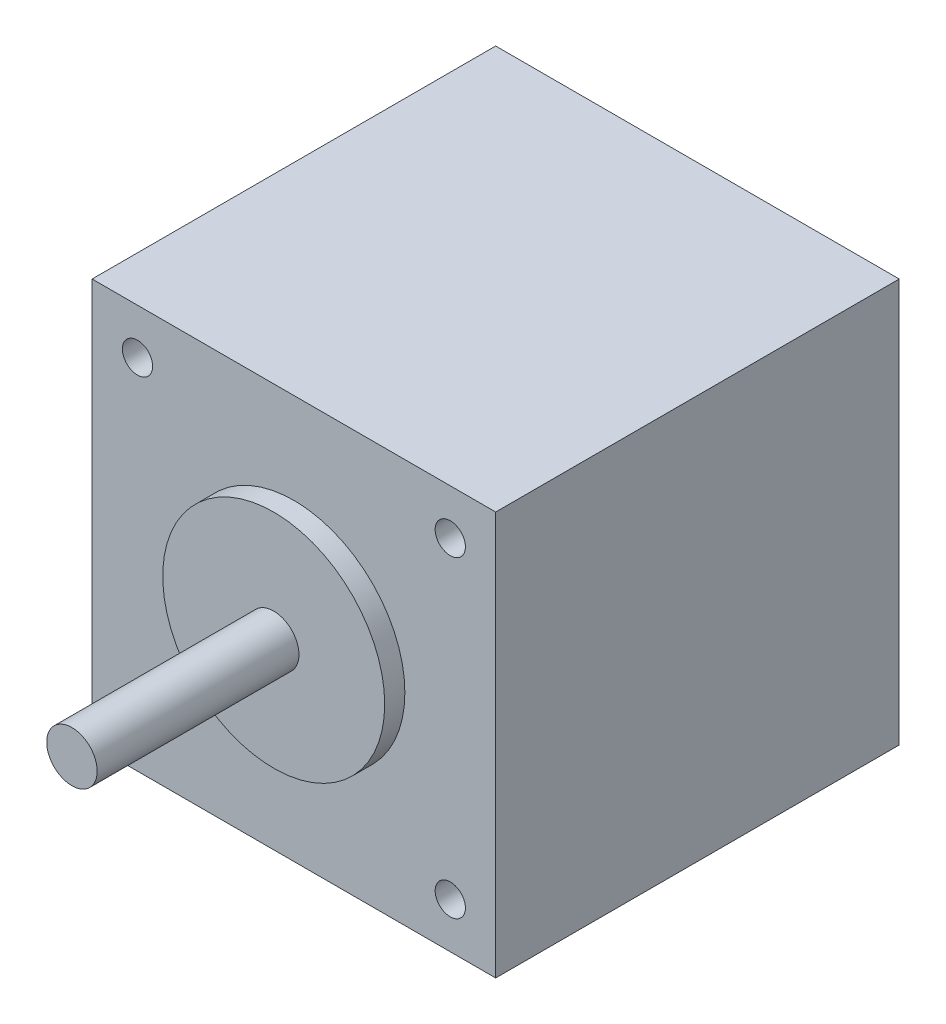
ISO-10303-21;
HEADER;
FILE_DESCRIPTION(('STEP AP214'),'2;1');
FILE_NAME('part.step','',(''),(''),'','','');
FILE_SCHEMA(('AUTOMOTIVE_DESIGN { 1 0 10303 214 1 1 1 1 }'));
ENDSEC;
DATA;
#1=APPLICATION_CONTEXT('core data for automotive mechanical design processes');
#2=APPLICATION_PROTOCOL_DEFINITION('international standard','automotive_design',2000,#1);
#3=PRODUCT_CONTEXT('',#1,'mechanical');
#4=PRODUCT('Part','Part','',(#3));
#5=PRODUCT_RELATED_PRODUCT_CATEGORY('part','',(#4));
#6=PRODUCT_DEFINITION_FORMATION('','',#4);
#7=PRODUCT_DEFINITION_CONTEXT('part definition',#1,'design');
#8=PRODUCT_DEFINITION('design','',#6,#7);
#9=PRODUCT_DEFINITION_SHAPE('','',#8);
#10=(LENGTH_UNIT() NAMED_UNIT(*) SI_UNIT(.MILLI.,.METRE.));
#11=(NAMED_UNIT(*) PLANE_ANGLE_UNIT() SI_UNIT($,.RADIAN.));
#12=(NAMED_UNIT(*) SI_UNIT($,.STERADIAN.) SOLID_ANGLE_UNIT());
#13=UNCERTAINTY_MEASURE_WITH_UNIT(LENGTH_MEASURE(1.E-05),#10,'distance_accuracy_value','');
#14=(GEOMETRIC_REPRESENTATION_CONTEXT(3) GLOBAL_UNCERTAINTY_ASSIGNED_CONTEXT((#13)) GLOBAL_UNIT_ASSIGNED_CONTEXT((#10,
#11,#12)) REPRESENTATION_CONTEXT('',''));
#15=CARTESIAN_POINT('',(0.,0.,0.));
#16=DIRECTION('',(0.,0.,1.));
#17=DIRECTION('',(1.,0.,0.));
#18=AXIS2_PLACEMENT_3D('',#15,#16,#17);
#19=CARTESIAN_POINT('',(0.,0.,40.));
#20=DIRECTION('',(0.,0.,-1.));
#21=DIRECTION('',(-1.,0.,0.));
#22=AXIS2_PLACEMENT_3D('',#19,#20,#21);
#23=PLANE('',#22);
#24=CARTESIAN_POINT('',(15.5,-15.5,40.));
#25=DIRECTION('',(0.,0.,1.));
#26=DIRECTION('',(1.,0.,0.));
#27=AXIS2_PLACEMENT_3D('',#24,#25,#26);
#28=CIRCLE('',#27,1.5);
#29=CARTESIAN_POINT('',(17.,-15.5,40.));
#30=VERTEX_POINT('',#29);
#31=EDGE_CURVE('E146',#30,#30,#28,.T.);
#32=ORIENTED_EDGE('',*,*,#31,.F.);
#33=EDGE_LOOP('',(#32));
#34=FACE_BOUND('',#33,.T.);
#35=CARTESIAN_POINT('',(-15.5,15.5,40.));
#36=DIRECTION('',(0.,0.,1.));
#37=DIRECTION('',(1.,0.,0.));
#38=AXIS2_PLACEMENT_3D('',#35,#36,#37);
#39=CIRCLE('',#38,1.5);
#40=CARTESIAN_POINT('',(-14.,15.5,40.));
#41=VERTEX_POINT('',#40);
#42=EDGE_CURVE('E128',#41,#41,#39,.T.);
#43=ORIENTED_EDGE('',*,*,#42,.F.);
#44=EDGE_LOOP('',(#43));
#45=FACE_BOUND('',#44,.T.);
#46=CARTESIAN_POINT('',(0.,0.,40.));
#47=DIRECTION('',(0.,0.,1.));
#48=DIRECTION('',(1.,0.,0.));
#49=AXIS2_PLACEMENT_3D('',#46,#47,#48);
#50=CIRCLE('',#49,11.);
#51=CARTESIAN_POINT('',(11.,0.,40.));
#52=VERTEX_POINT('',#51);
#53=EDGE_CURVE('E47',#52,#52,#50,.T.);
#54=ORIENTED_EDGE('',*,*,#53,.F.);
#55=EDGE_LOOP('',(#54));
#56=FACE_BOUND('',#55,.T.);
#57=DIRECTION('',(0.,-1.,0.));
#58=VECTOR('',#57,1.);
#59=CARTESIAN_POINT('',(-20.,20.,40.));
#60=LINE('',#59,#58);
#61=CARTESIAN_POINT('',(-20.,20.,40.));
#62=VERTEX_POINT('',#61);
#63=CARTESIAN_POINT('',(-20.,-20.,40.));
#64=VERTEX_POINT('',#63);
#65=EDGE_CURVE('E94',#62,#64,#60,.T.);
#66=ORIENTED_EDGE('',*,*,#65,.T.);
#67=DIRECTION('',(1.,0.,0.));
#68=VECTOR('',#67,1.);
#69=CARTESIAN_POINT('',(20.,-20.,40.));
#70=LINE('',#69,#68);
#71=CARTESIAN_POINT('',(20.,-20.,40.));
#72=VERTEX_POINT('',#71);
#73=EDGE_CURVE('E90',#64,#72,#70,.T.);
#74=ORIENTED_EDGE('',*,*,#73,.T.);
#75=DIRECTION('',(0.,1.,0.));
#76=VECTOR('',#75,1.);
#77=CARTESIAN_POINT('',(20.,20.,40.));
#78=LINE('',#77,#76);
#79=CARTESIAN_POINT('',(20.,20.,40.));
#80=VERTEX_POINT('',#79);
#81=EDGE_CURVE('E95',#72,#80,#78,.T.);
#82=ORIENTED_EDGE('',*,*,#81,.T.);
#83=DIRECTION('',(-1.,0.,0.));
#84=VECTOR('',#83,1.);
#85=CARTESIAN_POINT('',(20.,20.,40.));
#86=LINE('',#85,#84);
#87=EDGE_CURVE('E59',#80,#62,#86,.T.);
#88=ORIENTED_EDGE('',*,*,#87,.T.);
#89=EDGE_LOOP('',(#66,#74,#82,#88));
#90=FACE_BOUND('',#89,.T.);
#91=CARTESIAN_POINT('',(-15.5,-15.5,40.));
#92=DIRECTION('',(0.,0.,-1.));
#93=DIRECTION('',(-1.,0.,0.));
#94=AXIS2_PLACEMENT_3D('',#91,#92,#93);
#95=CIRCLE('',#94,1.5);
#96=CARTESIAN_POINT('',(-17.,-15.5,40.));
#97=VERTEX_POINT('',#96);
#98=EDGE_CURVE('E132',#97,#97,#95,.T.);
#99=ORIENTED_EDGE('',*,*,#98,.T.);
#100=EDGE_LOOP('',(#99));
#101=FACE_BOUND('',#100,.T.);
#102=CARTESIAN_POINT('',(15.5,15.5,40.));
#103=DIRECTION('',(0.,0.,-1.));
#104=DIRECTION('',(-1.,0.,0.));
#105=AXIS2_PLACEMENT_3D('',#102,#103,#104);
#106=CIRCLE('',#105,1.5);
#107=CARTESIAN_POINT('',(14.,15.5,40.));
#108=VERTEX_POINT('',#107);
#109=EDGE_CURVE('E140',#108,#108,#106,.T.);
#110=ORIENTED_EDGE('',*,*,#109,.T.);
#111=EDGE_LOOP('',(#110));
#112=FACE_BOUND('',#111,.T.);
#113=ADVANCED_FACE('F39',(#34,#45,#56,#90,#101,#112),#23,.F.);
#114=CARTESIAN_POINT('',(0.,0.,0.));
#115=DIRECTION('',(0.,0.,-1.));
#116=DIRECTION('',(-1.,0.,0.));
#117=AXIS2_PLACEMENT_3D('',#114,#115,#116);
#118=PLANE('',#117);
#119=CARTESIAN_POINT('',(15.5,-15.5,0.));
#120=DIRECTION('',(0.,0.,1.));
#121=DIRECTION('',(1.,0.,0.));
#122=AXIS2_PLACEMENT_3D('',#119,#120,#121);
#123=CIRCLE('',#122,1.5);
#124=CARTESIAN_POINT('',(17.,-15.5,0.));
#125=VERTEX_POINT('',#124);
#126=EDGE_CURVE('E136',#125,#125,#123,.T.);
#127=ORIENTED_EDGE('',*,*,#126,.T.);
#128=EDGE_LOOP('',(#127));
#129=FACE_BOUND('',#128,.T.);
#130=CARTESIAN_POINT('',(-15.5,-15.5,0.));
#131=DIRECTION('',(0.,0.,-1.));
#132=DIRECTION('',(-1.,0.,0.));
#133=AXIS2_PLACEMENT_3D('',#130,#131,#132);
#134=CIRCLE('',#133,1.5);
#135=CARTESIAN_POINT('',(-17.,-15.5,0.));
#136=VERTEX_POINT('',#135);
#137=EDGE_CURVE('E141',#136,#136,#134,.T.);
#138=ORIENTED_EDGE('',*,*,#137,.F.);
#139=EDGE_LOOP('',(#138));
#140=FACE_BOUND('',#139,.T.);
#141=CARTESIAN_POINT('',(-15.5,15.5,0.));
#142=DIRECTION('',(0.,0.,1.));
#143=DIRECTION('',(1.,0.,0.));
#144=AXIS2_PLACEMENT_3D('',#141,#142,#143);
#145=CIRCLE('',#144,1.5);
#146=CARTESIAN_POINT('',(-14.,15.5,0.));
#147=VERTEX_POINT('',#146);
#148=EDGE_CURVE('E129',#147,#147,#145,.T.);
#149=ORIENTED_EDGE('',*,*,#148,.T.);
#150=EDGE_LOOP('',(#149));
#151=FACE_BOUND('',#150,.T.);
#152=DIRECTION('',(0.,-1.,0.));
#153=VECTOR('',#152,1.);
#154=CARTESIAN_POINT('',(-20.,20.,0.));
#155=LINE('',#154,#153);
#156=CARTESIAN_POINT('',(-20.,20.,0.));
#157=VERTEX_POINT('',#156);
#158=CARTESIAN_POINT('',(-20.,-20.,0.));
#159=VERTEX_POINT('',#158);
#160=EDGE_CURVE('E110',#157,#159,#155,.T.);
#161=ORIENTED_EDGE('',*,*,#160,.F.);
#162=DIRECTION('',(-1.,0.,0.));
#163=VECTOR('',#162,1.);
#164=CARTESIAN_POINT('',(20.,20.,0.));
#165=LINE('',#164,#163);
#166=CARTESIAN_POINT('',(20.,20.,0.));
#167=VERTEX_POINT('',#166);
#168=EDGE_CURVE('E83',#167,#157,#165,.T.);
#169=ORIENTED_EDGE('',*,*,#168,.F.);
#170=DIRECTION('',(0.,1.,0.));
#171=VECTOR('',#170,1.);
#172=CARTESIAN_POINT('',(20.,20.,0.));
#173=LINE('',#172,#171);
#174=CARTESIAN_POINT('',(20.,-20.,0.));
#175=VERTEX_POINT('',#174);
#176=EDGE_CURVE('E73',#175,#167,#173,.T.);
#177=ORIENTED_EDGE('',*,*,#176,.F.);
#178=DIRECTION('',(1.,0.,0.));
#179=VECTOR('',#178,1.);
#180=CARTESIAN_POINT('',(20.,-20.,0.));
#181=LINE('',#180,#179);
#182=EDGE_CURVE('E97',#159,#175,#181,.T.);
#183=ORIENTED_EDGE('',*,*,#182,.F.);
#184=EDGE_LOOP('',(#161,#169,#177,#183));
#185=FACE_BOUND('',#184,.T.);
#186=CARTESIAN_POINT('',(15.5,15.5,0.));
#187=DIRECTION('',(0.,0.,-1.));
#188=DIRECTION('',(-1.,0.,0.));
#189=AXIS2_PLACEMENT_3D('',#186,#187,#188);
#190=CIRCLE('',#189,1.5);
#191=CARTESIAN_POINT('',(14.,15.5,0.));
#192=VERTEX_POINT('',#191);
#193=EDGE_CURVE('E138',#192,#192,#190,.T.);
#194=ORIENTED_EDGE('',*,*,#193,.F.);
#195=EDGE_LOOP('',(#194));
#196=FACE_BOUND('',#195,.T.);
#197=ADVANCED_FACE('F117',(#129,#140,#151,#185,#196),#118,.T.);
#198=CARTESIAN_POINT('',(-20.,20.,40.));
#199=DIRECTION('',(1.,0.,0.));
#200=DIRECTION('',(0.,0.,-1.));
#201=AXIS2_PLACEMENT_3D('',#198,#199,#200);
#202=PLANE('',#201);
#203=ORIENTED_EDGE('',*,*,#160,.T.);
#204=DIRECTION('',(0.,0.,-1.));
#205=VECTOR('',#204,1.);
#206=CARTESIAN_POINT('',(-20.,-20.,40.));
#207=LINE('',#206,#205);
#208=EDGE_CURVE('E43',#64,#159,#207,.T.);
#209=ORIENTED_EDGE('',*,*,#208,.F.);
#210=ORIENTED_EDGE('',*,*,#65,.F.);
#211=DIRECTION('',(0.,0.,-1.));
#212=VECTOR('',#211,1.);
#213=CARTESIAN_POINT('',(-20.,20.,40.));
#214=LINE('',#213,#212);
#215=EDGE_CURVE('E103',#62,#157,#214,.T.);
#216=ORIENTED_EDGE('',*,*,#215,.T.);
#217=EDGE_LOOP('',(#203,#209,#210,#216));
#218=FACE_BOUND('',#217,.T.);
#219=ADVANCED_FACE('F41',(#218),#202,.F.);
#220=CARTESIAN_POINT('',(20.,-20.,40.));
#221=DIRECTION('',(0.,1.,0.));
#222=DIRECTION('',(-1.,0.,0.));
#223=AXIS2_PLACEMENT_3D('',#220,#221,#222);
#224=PLANE('',#223);
#225=ORIENTED_EDGE('',*,*,#182,.T.);
#226=DIRECTION('',(0.,0.,-1.));
#227=VECTOR('',#226,1.);
#228=CARTESIAN_POINT('',(20.,-20.,40.));
#229=LINE('',#228,#227);
#230=EDGE_CURVE('E100',#72,#175,#229,.T.);
#231=ORIENTED_EDGE('',*,*,#230,.F.);
#232=ORIENTED_EDGE('',*,*,#73,.F.);
#233=ORIENTED_EDGE('',*,*,#208,.T.);
#234=EDGE_LOOP('',(#225,#231,#232,#233));
#235=FACE_BOUND('',#234,.T.);
#236=ADVANCED_FACE('F98',(#235),#224,.F.);
#237=CARTESIAN_POINT('',(20.,20.,40.));
#238=DIRECTION('',(-1.,0.,0.));
#239=DIRECTION('',(0.,-1.,0.));
#240=AXIS2_PLACEMENT_3D('',#237,#238,#239);
#241=PLANE('',#240);
#242=ORIENTED_EDGE('',*,*,#176,.T.);
#243=DIRECTION('',(0.,0.,-1.));
#244=VECTOR('',#243,1.);
#245=CARTESIAN_POINT('',(20.,20.,40.));
#246=LINE('',#245,#244);
#247=EDGE_CURVE('E99',#80,#167,#246,.T.);
#248=ORIENTED_EDGE('',*,*,#247,.F.);
#249=ORIENTED_EDGE('',*,*,#81,.F.);
#250=ORIENTED_EDGE('',*,*,#230,.T.);
#251=EDGE_LOOP('',(#242,#248,#249,#250));
#252=FACE_BOUND('',#251,.T.);
#253=ADVANCED_FACE('F101',(#252),#241,.F.);
#254=CARTESIAN_POINT('',(20.,20.,40.));
#255=DIRECTION('',(0.,-1.,0.));
#256=DIRECTION('',(1.,0.,0.));
#257=AXIS2_PLACEMENT_3D('',#254,#255,#256);
#258=PLANE('',#257);
#259=ORIENTED_EDGE('',*,*,#168,.T.);
#260=ORIENTED_EDGE('',*,*,#215,.F.);
#261=ORIENTED_EDGE('',*,*,#87,.F.);
#262=ORIENTED_EDGE('',*,*,#247,.T.);
#263=EDGE_LOOP('',(#259,#260,#261,#262));
#264=FACE_BOUND('',#263,.T.);
#265=ADVANCED_FACE('F113',(#264),#258,.F.);
#266=CARTESIAN_POINT('',(0.,0.,42.));
#267=DIRECTION('',(0.,0.,-1.));
#268=DIRECTION('',(-1.,0.,0.));
#269=AXIS2_PLACEMENT_3D('',#266,#267,#268);
#270=CYLINDRICAL_SURFACE('',#269,11.);
#271=CARTESIAN_POINT('',(0.,0.,42.));
#272=DIRECTION('',(0.,0.,1.));
#273=DIRECTION('',(1.,0.,0.));
#274=AXIS2_PLACEMENT_3D('',#271,#272,#273);
#275=CIRCLE('',#274,11.);
#276=CARTESIAN_POINT('',(11.,0.,42.));
#277=VERTEX_POINT('',#276);
#278=EDGE_CURVE('E109',#277,#277,#275,.T.);
#279=ORIENTED_EDGE('',*,*,#278,.F.);
#280=EDGE_LOOP('',(#279));
#281=FACE_BOUND('',#280,.T.);
#282=ORIENTED_EDGE('',*,*,#53,.T.);
#283=EDGE_LOOP('',(#282));
#284=FACE_BOUND('',#283,.T.);
#285=ADVANCED_FACE('F168',(#281,#284),#270,.T.);
#286=CARTESIAN_POINT('',(0.,0.,42.));
#287=DIRECTION('',(0.,0.,1.));
#288=DIRECTION('',(1.,0.,0.));
#289=AXIS2_PLACEMENT_3D('',#286,#287,#288);
#290=PLANE('',#289);
#291=CARTESIAN_POINT('',(0.,0.,42.));
#292=DIRECTION('',(0.,0.,1.));
#293=DIRECTION('',(1.,0.,0.));
#294=AXIS2_PLACEMENT_3D('',#291,#292,#293);
#295=CIRCLE('',#294,2.5);
#296=CARTESIAN_POINT('',(2.5,0.,42.));
#297=VERTEX_POINT('',#296);
#298=EDGE_CURVE('E11',#297,#297,#295,.T.);
#299=ORIENTED_EDGE('',*,*,#298,.F.);
#300=EDGE_LOOP('',(#299));
#301=FACE_BOUND('',#300,.T.);
#302=ORIENTED_EDGE('',*,*,#278,.T.);
#303=EDGE_LOOP('',(#302));
#304=FACE_BOUND('',#303,.T.);
#305=ADVANCED_FACE('F175',(#301,#304),#290,.T.);
#306=CARTESIAN_POINT('',(0.,0.,62.));
#307=DIRECTION('',(0.,0.,-1.));
#308=DIRECTION('',(-1.,0.,0.));
#309=AXIS2_PLACEMENT_3D('',#306,#307,#308);
#310=CYLINDRICAL_SURFACE('',#309,2.5);
#311=CARTESIAN_POINT('',(0.,0.,62.));
#312=DIRECTION('',(0.,0.,1.));
#313=DIRECTION('',(1.,0.,0.));
#314=AXIS2_PLACEMENT_3D('',#311,#312,#313);
#315=CIRCLE('',#314,2.5);
#316=CARTESIAN_POINT('',(2.5,0.,62.));
#317=VERTEX_POINT('',#316);
#318=EDGE_CURVE('E121',#317,#317,#315,.T.);
#319=ORIENTED_EDGE('',*,*,#318,.F.);
#320=EDGE_LOOP('',(#319));
#321=FACE_BOUND('',#320,.T.);
#322=ORIENTED_EDGE('',*,*,#298,.T.);
#323=EDGE_LOOP('',(#322));
#324=FACE_BOUND('',#323,.T.);
#325=ADVANCED_FACE('F180',(#321,#324),#310,.T.);
#326=CARTESIAN_POINT('',(0.,0.,62.));
#327=DIRECTION('',(0.,0.,1.));
#328=DIRECTION('',(1.,0.,0.));
#329=AXIS2_PLACEMENT_3D('',#326,#327,#328);
#330=PLANE('',#329);
#331=ORIENTED_EDGE('',*,*,#318,.T.);
#332=EDGE_LOOP('',(#331));
#333=FACE_BOUND('',#332,.T.);
#334=ADVANCED_FACE('F233',(#333),#330,.T.);
#335=CARTESIAN_POINT('',(-15.5,15.5,0.));
#336=DIRECTION('',(0.,0.,1.));
#337=DIRECTION('',(1.,0.,0.));
#338=AXIS2_PLACEMENT_3D('',#335,#336,#337);
#339=CYLINDRICAL_SURFACE('',#338,1.5);
#340=ORIENTED_EDGE('',*,*,#148,.F.);
#341=EDGE_LOOP('',(#340));
#342=FACE_BOUND('',#341,.T.);
#343=ORIENTED_EDGE('',*,*,#42,.T.);
#344=EDGE_LOOP('',(#343));
#345=FACE_BOUND('',#344,.T.);
#346=ADVANCED_FACE('F238',(#342,#345),#339,.F.);
#347=CARTESIAN_POINT('',(-15.5,-15.5,0.));
#348=DIRECTION('',(0.,0.,1.));
#349=DIRECTION('',(1.,0.,0.));
#350=AXIS2_PLACEMENT_3D('',#347,#348,#349);
#351=CYLINDRICAL_SURFACE('',#350,1.5);
#352=ORIENTED_EDGE('',*,*,#137,.T.);
#353=EDGE_LOOP('',(#352));
#354=FACE_BOUND('',#353,.T.);
#355=ORIENTED_EDGE('',*,*,#98,.F.);
#356=EDGE_LOOP('',(#355));
#357=FACE_BOUND('',#356,.T.);
#358=ADVANCED_FACE('F263',(#354,#357),#351,.F.);
#359=CARTESIAN_POINT('',(15.5,15.5,0.));
#360=DIRECTION('',(0.,0.,1.));
#361=DIRECTION('',(1.,0.,0.));
#362=AXIS2_PLACEMENT_3D('',#359,#360,#361);
#363=CYLINDRICAL_SURFACE('',#362,1.5);
#364=ORIENTED_EDGE('',*,*,#193,.T.);
#365=EDGE_LOOP('',(#364));
#366=FACE_BOUND('',#365,.T.);
#367=ORIENTED_EDGE('',*,*,#109,.F.);
#368=EDGE_LOOP('',(#367));
#369=FACE_BOUND('',#368,.T.);
#370=ADVANCED_FACE('F157',(#366,#369),#363,.F.);
#371=CARTESIAN_POINT('',(15.5,-15.5,0.));
#372=DIRECTION('',(0.,0.,1.));
#373=DIRECTION('',(1.,0.,0.));
#374=AXIS2_PLACEMENT_3D('',#371,#372,#373);
#375=CYLINDRICAL_SURFACE('',#374,1.5);
#376=ORIENTED_EDGE('',*,*,#126,.F.);
#377=EDGE_LOOP('',(#376));
#378=FACE_BOUND('',#377,.T.);
#379=ORIENTED_EDGE('',*,*,#31,.T.);
#380=EDGE_LOOP('',(#379));
#381=FACE_BOUND('',#380,.T.);
#382=ADVANCED_FACE('F156',(#378,#381),#375,.F.);
#383=CLOSED_SHELL('',(#113,#197,#219,#236,#253,#265,#285,#305,#325,#334,#346,#358,#370,#382));
#384=MANIFOLD_SOLID_BREP('B2',#383);
#385=ADVANCED_BREP_SHAPE_REPRESENTATION('',(#18,#384),#14);
#386=SHAPE_DEFINITION_REPRESENTATION(#9,#385);
ENDSEC;
END-ISO-10303-21;
